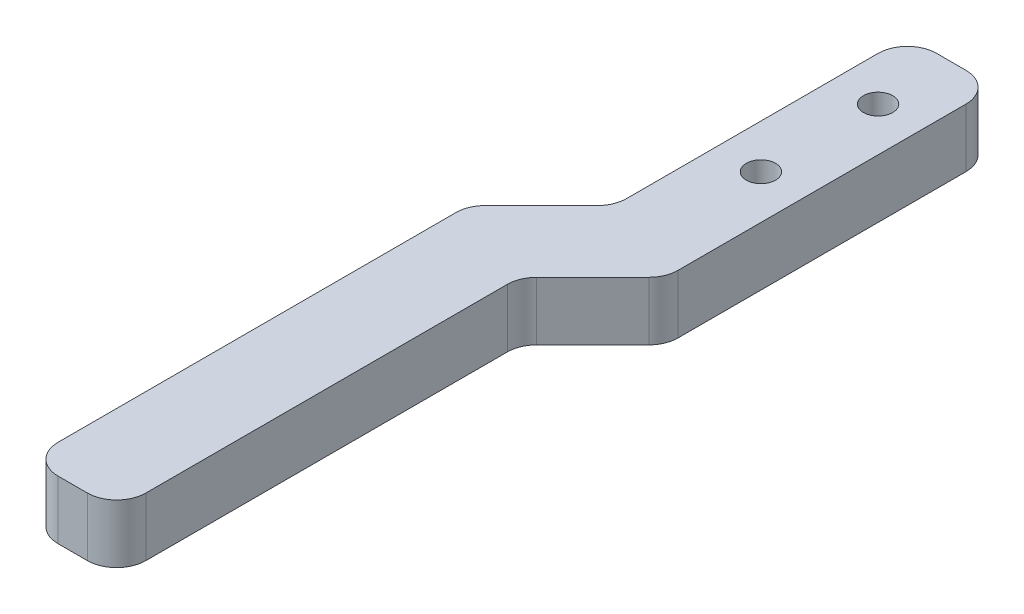
ISO-10303-21;
HEADER;
FILE_DESCRIPTION(('STEP AP214'),'2;1');
FILE_NAME('part.step','',(''),(''),'','','');
FILE_SCHEMA(('AUTOMOTIVE_DESIGN { 1 0 10303 214 1 1 1 1 }'));
ENDSEC;
DATA;
#1=APPLICATION_CONTEXT('core data for automotive mechanical design processes');
#2=APPLICATION_PROTOCOL_DEFINITION('international standard','automotive_design',2000,#1);
#3=PRODUCT_CONTEXT('',#1,'mechanical');
#4=PRODUCT('Part','Part','',(#3));
#5=PRODUCT_RELATED_PRODUCT_CATEGORY('part','',(#4));
#6=PRODUCT_DEFINITION_FORMATION('','',#4);
#7=PRODUCT_DEFINITION_CONTEXT('part definition',#1,'design');
#8=PRODUCT_DEFINITION('design','',#6,#7);
#9=PRODUCT_DEFINITION_SHAPE('','',#8);
#10=(LENGTH_UNIT() NAMED_UNIT(*) SI_UNIT(.MILLI.,.METRE.));
#11=(NAMED_UNIT(*) PLANE_ANGLE_UNIT() SI_UNIT($,.RADIAN.));
#12=(NAMED_UNIT(*) SI_UNIT($,.STERADIAN.) SOLID_ANGLE_UNIT());
#13=UNCERTAINTY_MEASURE_WITH_UNIT(LENGTH_MEASURE(1.E-05),#10,'distance_accuracy_value','');
#14=(GEOMETRIC_REPRESENTATION_CONTEXT(3) GLOBAL_UNCERTAINTY_ASSIGNED_CONTEXT((#13)) GLOBAL_UNIT_ASSIGNED_CONTEXT((#10,
#11,#12)) REPRESENTATION_CONTEXT('',''));
#15=CARTESIAN_POINT('',(0.,0.,0.));
#16=DIRECTION('',(0.,0.,1.));
#17=DIRECTION('',(1.,0.,0.));
#18=AXIS2_PLACEMENT_3D('',#15,#16,#17);
#19=CARTESIAN_POINT('',(0.,4.,0.));
#20=DIRECTION('',(0.,1.,0.));
#21=DIRECTION('',(0.,0.,1.));
#22=AXIS2_PLACEMENT_3D('',#19,#20,#21);
#23=PLANE('',#22);
#24=CARTESIAN_POINT('',(33.0000000000001,4.,-60.));
#25=DIRECTION('',(0.,1.,0.));
#26=DIRECTION('',(0.,0.,1.));
#27=AXIS2_PLACEMENT_3D('',#24,#25,#26);
#28=CIRCLE('',#27,0.999999999999994);
#29=CARTESIAN_POINT('',(33.0000000000001,4.,-59.));
#30=VERTEX_POINT('',#29);
#31=EDGE_CURVE('E269',#30,#30,#28,.T.);
#32=ORIENTED_EDGE('',*,*,#31,.F.);
#33=EDGE_LOOP('',(#32));
#34=FACE_BOUND('',#33,.T.);
#35=DIRECTION('',(-0.707106781186549,0.,0.707106781186546));
#36=VECTOR('',#35,1.);
#37=CARTESIAN_POINT('',(25.,4.,-40.));
#38=LINE('',#37,#36);
#39=CARTESIAN_POINT('',(29.4142135623731,4.,-44.4142135623731));
#40=VERTEX_POINT('',#39);
#41=CARTESIAN_POINT('',(25.5857864376269,4.,-40.5857864376269));
#42=VERTEX_POINT('',#41);
#43=EDGE_CURVE('E191',#40,#42,#38,.T.);
#44=ORIENTED_EDGE('',*,*,#43,.T.);
#45=CARTESIAN_POINT('',(27.,4.,-39.1715728752538));
#46=DIRECTION('',(0.,1.,0.));
#47=DIRECTION('',(0.,0.,1.));
#48=AXIS2_PLACEMENT_3D('',#45,#46,#47);
#49=CIRCLE('',#48,2.);
#50=CARTESIAN_POINT('',(25.,4.,-39.1715728752538));
#51=VERTEX_POINT('',#50);
#52=EDGE_CURVE('E212',#42,#51,#49,.T.);
#53=ORIENTED_EDGE('',*,*,#52,.T.);
#54=DIRECTION('',(0.,0.,1.));
#55=VECTOR('',#54,1.);
#56=CARTESIAN_POINT('',(25.,4.,-30.));
#57=LINE('',#56,#55);
#58=CARTESIAN_POINT('',(25.,4.,-12.));
#59=VERTEX_POINT('',#58);
#60=EDGE_CURVE('E175',#51,#59,#57,.T.);
#61=ORIENTED_EDGE('',*,*,#60,.T.);
#62=CARTESIAN_POINT('',(27.,4.,-12.));
#63=DIRECTION('',(0.,1.,0.));
#64=DIRECTION('',(0.,0.,1.));
#65=AXIS2_PLACEMENT_3D('',#62,#63,#64);
#66=CIRCLE('',#65,2.);
#67=CARTESIAN_POINT('',(27.,4.,-10.));
#68=VERTEX_POINT('',#67);
#69=EDGE_CURVE('E208',#59,#68,#66,.T.);
#70=ORIENTED_EDGE('',*,*,#69,.T.);
#71=DIRECTION('',(1.,0.,0.));
#72=VECTOR('',#71,1.);
#73=CARTESIAN_POINT('',(25.,4.,-10.));
#74=LINE('',#73,#72);
#75=CARTESIAN_POINT('',(29.,4.,-10.));
#76=VERTEX_POINT('',#75);
#77=EDGE_CURVE('E185',#68,#76,#74,.T.);
#78=ORIENTED_EDGE('',*,*,#77,.T.);
#79=CARTESIAN_POINT('',(29.,4.,-12.));
#80=DIRECTION('',(0.,1.,0.));
#81=DIRECTION('',(0.,0.,1.));
#82=AXIS2_PLACEMENT_3D('',#79,#80,#81);
#83=CIRCLE('',#82,2.);
#84=CARTESIAN_POINT('',(31.,4.,-12.));
#85=VERTEX_POINT('',#84);
#86=EDGE_CURVE('E210',#76,#85,#83,.T.);
#87=ORIENTED_EDGE('',*,*,#86,.T.);
#88=DIRECTION('',(0.,0.,-1.));
#89=VECTOR('',#88,1.);
#90=CARTESIAN_POINT('',(31.,4.,-10.));
#91=LINE('',#90,#89);
#92=CARTESIAN_POINT('',(31.,4.,-36.6862915010152));
#93=VERTEX_POINT('',#92);
#94=EDGE_CURVE('E364',#85,#93,#91,.T.);
#95=ORIENTED_EDGE('',*,*,#94,.T.);
#96=CARTESIAN_POINT('',(33.,4.,-36.6862915010152));
#97=DIRECTION('',(0.,1.,0.));
#98=DIRECTION('',(0.,0.,1.));
#99=AXIS2_PLACEMENT_3D('',#96,#97,#98);
#100=CIRCLE('',#99,2.);
#101=CARTESIAN_POINT('',(31.5857864376269,4.,-38.1005050633883));
#102=VERTEX_POINT('',#101);
#103=EDGE_CURVE('E245',#93,#102,#100,.F.);
#104=ORIENTED_EDGE('',*,*,#103,.T.);
#105=DIRECTION('',(0.707106781186548,0.,-0.707106781186547));
#106=VECTOR('',#105,1.);
#107=CARTESIAN_POINT('',(31.,4.,-37.5147186257614));
#108=LINE('',#107,#106);
#109=CARTESIAN_POINT('',(35.4142135623731,4.,-41.9289321881345));
#110=VERTEX_POINT('',#109);
#111=EDGE_CURVE('E360',#102,#110,#108,.T.);
#112=ORIENTED_EDGE('',*,*,#111,.T.);
#113=CARTESIAN_POINT('',(34.,4.,-43.3431457505076));
#114=DIRECTION('',(0.,1.,0.));
#115=DIRECTION('',(0.,0.,1.));
#116=AXIS2_PLACEMENT_3D('',#113,#114,#115);
#117=CIRCLE('',#116,2.);
#118=CARTESIAN_POINT('',(36.,4.,-43.3431457505076));
#119=VERTEX_POINT('',#118);
#120=EDGE_CURVE('E206',#110,#119,#117,.T.);
#121=ORIENTED_EDGE('',*,*,#120,.T.);
#122=DIRECTION('',(0.,0.,-1.));
#123=VECTOR('',#122,1.);
#124=CARTESIAN_POINT('',(36.0000000000001,4.,-64.9999999999999));
#125=LINE('',#124,#123);
#126=CARTESIAN_POINT('',(36.0000000000001,4.,-62.9999999999999));
#127=VERTEX_POINT('',#126);
#128=EDGE_CURVE('E357',#119,#127,#125,.T.);
#129=ORIENTED_EDGE('',*,*,#128,.T.);
#130=CARTESIAN_POINT('',(34.0000000000001,4.,-63.));
#131=DIRECTION('',(0.,1.,0.));
#132=DIRECTION('',(0.,0.,1.));
#133=AXIS2_PLACEMENT_3D('',#130,#131,#132);
#134=CIRCLE('',#133,2.);
#135=CARTESIAN_POINT('',(34.0000000000002,4.,-65.));
#136=VERTEX_POINT('',#135);
#137=EDGE_CURVE('E204',#127,#136,#134,.T.);
#138=ORIENTED_EDGE('',*,*,#137,.T.);
#139=DIRECTION('',(-1.,0.,0.));
#140=VECTOR('',#139,1.);
#141=CARTESIAN_POINT('',(30.0000000000002,4.,-65.));
#142=LINE('',#141,#140);
#143=CARTESIAN_POINT('',(32.0000000000002,4.,-65.));
#144=VERTEX_POINT('',#143);
#145=EDGE_CURVE('E261',#136,#144,#142,.T.);
#146=ORIENTED_EDGE('',*,*,#145,.T.);
#147=CARTESIAN_POINT('',(32.0000000000001,4.,-63.));
#148=DIRECTION('',(0.,1.,0.));
#149=DIRECTION('',(0.,0.,1.));
#150=AXIS2_PLACEMENT_3D('',#147,#148,#149);
#151=CIRCLE('',#150,2.);
#152=CARTESIAN_POINT('',(30.0000000000001,4.,-63.));
#153=VERTEX_POINT('',#152);
#154=EDGE_CURVE('E63',#144,#153,#151,.T.);
#155=ORIENTED_EDGE('',*,*,#154,.T.);
#156=DIRECTION('',(0.,0.,1.));
#157=VECTOR('',#156,1.);
#158=CARTESIAN_POINT('',(30.,4.,-45.));
#159=LINE('',#158,#157);
#160=CARTESIAN_POINT('',(30.,4.,-45.8284271247462));
#161=VERTEX_POINT('',#160);
#162=EDGE_CURVE('E257',#153,#161,#159,.T.);
#163=ORIENTED_EDGE('',*,*,#162,.T.);
#164=CARTESIAN_POINT('',(28.,4.,-45.8284271247462));
#165=DIRECTION('',(0.,1.,0.));
#166=DIRECTION('',(0.,0.,1.));
#167=AXIS2_PLACEMENT_3D('',#164,#165,#166);
#168=CIRCLE('',#167,2.);
#169=EDGE_CURVE('E11',#161,#40,#168,.F.);
#170=ORIENTED_EDGE('',*,*,#169,.T.);
#171=EDGE_LOOP('',(#44,#53,#61,#70,#78,#87,#95,#104,#112,#121,#129,#138,#146,#155,#163,#170));
#172=FACE_BOUND('',#171,.T.);
#173=CARTESIAN_POINT('',(33.0000000000001,4.,-52.));
#174=DIRECTION('',(0.,1.,0.));
#175=DIRECTION('',(0.,0.,1.));
#176=AXIS2_PLACEMENT_3D('',#173,#174,#175);
#177=CIRCLE('',#176,1.);
#178=CARTESIAN_POINT('',(33.0000000000001,4.,-51.));
#179=VERTEX_POINT('',#178);
#180=EDGE_CURVE('E374',#179,#179,#177,.T.);
#181=ORIENTED_EDGE('',*,*,#180,.F.);
#182=EDGE_LOOP('',(#181));
#183=FACE_BOUND('',#182,.T.);
#184=ADVANCED_FACE('F41',(#34,#172,#183),#23,.T.);
#185=CARTESIAN_POINT('',(0.,0.,0.));
#186=DIRECTION('',(0.,1.,0.));
#187=DIRECTION('',(0.,0.,1.));
#188=AXIS2_PLACEMENT_3D('',#185,#186,#187);
#189=PLANE('',#188);
#190=DIRECTION('',(0.,0.,1.));
#191=VECTOR('',#190,1.);
#192=CARTESIAN_POINT('',(25.,0.,-30.));
#193=LINE('',#192,#191);
#194=CARTESIAN_POINT('',(25.,0.,-39.1715728752538));
#195=VERTEX_POINT('',#194);
#196=CARTESIAN_POINT('',(25.,0.,-12.));
#197=VERTEX_POINT('',#196);
#198=EDGE_CURVE('E172',#195,#197,#193,.T.);
#199=ORIENTED_EDGE('',*,*,#198,.F.);
#200=CARTESIAN_POINT('',(27.,0.,-39.1715728752538));
#201=DIRECTION('',(0.,1.,0.));
#202=DIRECTION('',(0.,0.,1.));
#203=AXIS2_PLACEMENT_3D('',#200,#201,#202);
#204=CIRCLE('',#203,2.);
#205=CARTESIAN_POINT('',(25.5857864376269,0.,-40.5857864376269));
#206=VERTEX_POINT('',#205);
#207=EDGE_CURVE('E155',#195,#206,#204,.F.);
#208=ORIENTED_EDGE('',*,*,#207,.T.);
#209=DIRECTION('',(-0.707106781186549,0.,0.707106781186546));
#210=VECTOR('',#209,1.);
#211=CARTESIAN_POINT('',(25.,0.,-40.));
#212=LINE('',#211,#210);
#213=CARTESIAN_POINT('',(29.4142135623731,0.,-44.4142135623731));
#214=VERTEX_POINT('',#213);
#215=EDGE_CURVE('E183',#214,#206,#212,.T.);
#216=ORIENTED_EDGE('',*,*,#215,.F.);
#217=CARTESIAN_POINT('',(28.,0.,-45.8284271247462));
#218=DIRECTION('',(0.,1.,0.));
#219=DIRECTION('',(0.,0.,1.));
#220=AXIS2_PLACEMENT_3D('',#217,#218,#219);
#221=CIRCLE('',#220,2.);
#222=CARTESIAN_POINT('',(30.,0.,-45.8284271247462));
#223=VERTEX_POINT('',#222);
#224=EDGE_CURVE('E49',#214,#223,#221,.T.);
#225=ORIENTED_EDGE('',*,*,#224,.T.);
#226=DIRECTION('',(0.,0.,1.));
#227=VECTOR('',#226,1.);
#228=CARTESIAN_POINT('',(30.,0.,-45.));
#229=LINE('',#228,#227);
#230=CARTESIAN_POINT('',(30.0000000000001,0.,-63.));
#231=VERTEX_POINT('',#230);
#232=EDGE_CURVE('E187',#231,#223,#229,.T.);
#233=ORIENTED_EDGE('',*,*,#232,.F.);
#234=CARTESIAN_POINT('',(32.0000000000001,0.,-63.));
#235=DIRECTION('',(0.,1.,0.));
#236=DIRECTION('',(0.,0.,1.));
#237=AXIS2_PLACEMENT_3D('',#234,#235,#236);
#238=CIRCLE('',#237,2.);
#239=CARTESIAN_POINT('',(32.0000000000002,0.,-65.));
#240=VERTEX_POINT('',#239);
#241=EDGE_CURVE('E176',#231,#240,#238,.F.);
#242=ORIENTED_EDGE('',*,*,#241,.T.);
#243=DIRECTION('',(-1.,0.,0.));
#244=VECTOR('',#243,1.);
#245=CARTESIAN_POINT('',(30.0000000000002,0.,-65.));
#246=LINE('',#245,#244);
#247=CARTESIAN_POINT('',(34.0000000000002,0.,-65.));
#248=VERTEX_POINT('',#247);
#249=EDGE_CURVE('E251',#248,#240,#246,.T.);
#250=ORIENTED_EDGE('',*,*,#249,.F.);
#251=CARTESIAN_POINT('',(34.0000000000001,0.,-63.));
#252=DIRECTION('',(0.,1.,0.));
#253=DIRECTION('',(0.,0.,1.));
#254=AXIS2_PLACEMENT_3D('',#251,#252,#253);
#255=CIRCLE('',#254,2.);
#256=CARTESIAN_POINT('',(36.0000000000001,0.,-62.9999999999999));
#257=VERTEX_POINT('',#256);
#258=EDGE_CURVE('E194',#248,#257,#255,.F.);
#259=ORIENTED_EDGE('',*,*,#258,.T.);
#260=DIRECTION('',(0.,0.,-1.));
#261=VECTOR('',#260,1.);
#262=CARTESIAN_POINT('',(36.0000000000001,0.,-64.9999999999999));
#263=LINE('',#262,#261);
#264=CARTESIAN_POINT('',(36.,0.,-43.3431457505076));
#265=VERTEX_POINT('',#264);
#266=EDGE_CURVE('E275',#265,#257,#263,.T.);
#267=ORIENTED_EDGE('',*,*,#266,.F.);
#268=CARTESIAN_POINT('',(34.,0.,-43.3431457505076));
#269=DIRECTION('',(0.,1.,0.));
#270=DIRECTION('',(0.,0.,1.));
#271=AXIS2_PLACEMENT_3D('',#268,#269,#270);
#272=CIRCLE('',#271,2.);
#273=CARTESIAN_POINT('',(35.4142135623731,0.,-41.9289321881345));
#274=VERTEX_POINT('',#273);
#275=EDGE_CURVE('E196',#265,#274,#272,.F.);
#276=ORIENTED_EDGE('',*,*,#275,.T.);
#277=DIRECTION('',(0.707106781186548,0.,-0.707106781186547));
#278=VECTOR('',#277,1.);
#279=CARTESIAN_POINT('',(31.,0.,-37.5147186257614));
#280=LINE('',#279,#278);
#281=CARTESIAN_POINT('',(31.5857864376269,0.,-38.1005050633883));
#282=VERTEX_POINT('',#281);
#283=EDGE_CURVE('E272',#282,#274,#280,.T.);
#284=ORIENTED_EDGE('',*,*,#283,.F.);
#285=CARTESIAN_POINT('',(33.,0.,-36.6862915010152));
#286=DIRECTION('',(0.,1.,0.));
#287=DIRECTION('',(0.,0.,1.));
#288=AXIS2_PLACEMENT_3D('',#285,#286,#287);
#289=CIRCLE('',#288,2.);
#290=CARTESIAN_POINT('',(31.,0.,-36.6862915010152));
#291=VERTEX_POINT('',#290);
#292=EDGE_CURVE('E243',#282,#291,#289,.T.);
#293=ORIENTED_EDGE('',*,*,#292,.T.);
#294=DIRECTION('',(0.,0.,-1.));
#295=VECTOR('',#294,1.);
#296=CARTESIAN_POINT('',(31.,0.,-25.5147186257614));
#297=LINE('',#296,#295);
#298=CARTESIAN_POINT('',(31.,0.,-12.));
#299=VERTEX_POINT('',#298);
#300=EDGE_CURVE('E268',#299,#291,#297,.T.);
#301=ORIENTED_EDGE('',*,*,#300,.F.);
#302=CARTESIAN_POINT('',(29.,0.,-12.));
#303=DIRECTION('',(0.,1.,0.));
#304=DIRECTION('',(0.,0.,1.));
#305=AXIS2_PLACEMENT_3D('',#302,#303,#304);
#306=CIRCLE('',#305,2.);
#307=CARTESIAN_POINT('',(29.,0.,-10.));
#308=VERTEX_POINT('',#307);
#309=EDGE_CURVE('E166',#299,#308,#306,.F.);
#310=ORIENTED_EDGE('',*,*,#309,.T.);
#311=DIRECTION('',(1.,0.,0.));
#312=VECTOR('',#311,1.);
#313=CARTESIAN_POINT('',(25.,0.,-10.));
#314=LINE('',#313,#312);
#315=CARTESIAN_POINT('',(27.,0.,-10.));
#316=VERTEX_POINT('',#315);
#317=EDGE_CURVE('E265',#316,#308,#314,.T.);
#318=ORIENTED_EDGE('',*,*,#317,.F.);
#319=CARTESIAN_POINT('',(27.,0.,-12.));
#320=DIRECTION('',(0.,1.,0.));
#321=DIRECTION('',(0.,0.,1.));
#322=AXIS2_PLACEMENT_3D('',#319,#320,#321);
#323=CIRCLE('',#322,2.);
#324=EDGE_CURVE('E182',#316,#197,#323,.F.);
#325=ORIENTED_EDGE('',*,*,#324,.T.);
#326=EDGE_LOOP('',(#199,#208,#216,#225,#233,#242,#250,#259,#267,#276,#284,#293,#301,#310,#318,#325));
#327=FACE_BOUND('',#326,.T.);
#328=CARTESIAN_POINT('',(33.0000000000001,0.,-60.));
#329=DIRECTION('',(0.,1.,0.));
#330=DIRECTION('',(0.,0.,1.));
#331=AXIS2_PLACEMENT_3D('',#328,#329,#330);
#332=CIRCLE('',#331,0.999999999999994);
#333=CARTESIAN_POINT('',(33.0000000000001,0.,-59.));
#334=VERTEX_POINT('',#333);
#335=EDGE_CURVE('E371',#334,#334,#332,.T.);
#336=ORIENTED_EDGE('',*,*,#335,.T.);
#337=EDGE_LOOP('',(#336));
#338=FACE_BOUND('',#337,.T.);
#339=CARTESIAN_POINT('',(33.0000000000001,0.,-52.));
#340=DIRECTION('',(0.,1.,0.));
#341=DIRECTION('',(0.,0.,1.));
#342=AXIS2_PLACEMENT_3D('',#339,#340,#341);
#343=CIRCLE('',#342,1.);
#344=CARTESIAN_POINT('',(33.0000000000001,0.,-51.));
#345=VERTEX_POINT('',#344);
#346=EDGE_CURVE('E377',#345,#345,#343,.T.);
#347=ORIENTED_EDGE('',*,*,#346,.T.);
#348=EDGE_LOOP('',(#347));
#349=FACE_BOUND('',#348,.T.);
#350=ADVANCED_FACE('F179',(#327,#338,#349),#189,.F.);
#351=CARTESIAN_POINT('',(25.,4.,-10.));
#352=DIRECTION('',(0.,0.,-1.));
#353=DIRECTION('',(-1.,0.,0.));
#354=AXIS2_PLACEMENT_3D('',#351,#352,#353);
#355=PLANE('',#354);
#356=ORIENTED_EDGE('',*,*,#317,.T.);
#357=DIRECTION('',(0.,-1.,0.));
#358=VECTOR('',#357,1.);
#359=CARTESIAN_POINT('',(29.,4.,-10.));
#360=LINE('',#359,#358);
#361=EDGE_CURVE('E222',#308,#76,#360,.F.);
#362=ORIENTED_EDGE('',*,*,#361,.T.);
#363=ORIENTED_EDGE('',*,*,#77,.F.);
#364=DIRECTION('',(0.,-1.,0.));
#365=VECTOR('',#364,1.);
#366=CARTESIAN_POINT('',(27.,4.,-10.));
#367=LINE('',#366,#365);
#368=EDGE_CURVE('E219',#68,#316,#367,.T.);
#369=ORIENTED_EDGE('',*,*,#368,.T.);
#370=EDGE_LOOP('',(#356,#362,#363,#369));
#371=FACE_BOUND('',#370,.T.);
#372=ADVANCED_FACE('F300',(#371),#355,.F.);
#373=CARTESIAN_POINT('',(31.,4.,-25.5147186257614));
#374=DIRECTION('',(-1.,0.,0.));
#375=DIRECTION('',(0.,0.,1.));
#376=AXIS2_PLACEMENT_3D('',#373,#374,#375);
#377=PLANE('',#376);
#378=ORIENTED_EDGE('',*,*,#94,.F.);
#379=DIRECTION('',(0.,-1.,0.));
#380=VECTOR('',#379,1.);
#381=CARTESIAN_POINT('',(31.,4.,-12.));
#382=LINE('',#381,#380);
#383=EDGE_CURVE('E216',#85,#299,#382,.T.);
#384=ORIENTED_EDGE('',*,*,#383,.T.);
#385=ORIENTED_EDGE('',*,*,#300,.T.);
#386=DIRECTION('',(0.,-1.,0.));
#387=VECTOR('',#386,1.);
#388=CARTESIAN_POINT('',(31.,4.,-36.6862915010152));
#389=LINE('',#388,#387);
#390=EDGE_CURVE('E214',#291,#93,#389,.F.);
#391=ORIENTED_EDGE('',*,*,#390,.T.);
#392=EDGE_LOOP('',(#378,#384,#385,#391));
#393=FACE_BOUND('',#392,.T.);
#394=ADVANCED_FACE('F322',(#393),#377,.F.);
#395=CARTESIAN_POINT('',(31.,4.,-37.5147186257614));
#396=DIRECTION('',(-0.707106781186547,0.,-0.707106781186548));
#397=DIRECTION('',(-0.707106781186548,0.,0.707106781186547));
#398=AXIS2_PLACEMENT_3D('',#395,#396,#397);
#399=PLANE('',#398);
#400=ORIENTED_EDGE('',*,*,#111,.F.);
#401=DIRECTION('',(0.,-1.,0.));
#402=VECTOR('',#401,1.);
#403=CARTESIAN_POINT('',(31.5857864376269,0.,-38.1005050633883));
#404=LINE('',#403,#402);
#405=EDGE_CURVE('E226',#102,#282,#404,.T.);
#406=ORIENTED_EDGE('',*,*,#405,.T.);
#407=ORIENTED_EDGE('',*,*,#283,.T.);
#408=DIRECTION('',(0.,-1.,0.));
#409=VECTOR('',#408,1.);
#410=CARTESIAN_POINT('',(35.4142135623731,4.,-41.9289321881345));
#411=LINE('',#410,#409);
#412=EDGE_CURVE('E224',#274,#110,#411,.F.);
#413=ORIENTED_EDGE('',*,*,#412,.T.);
#414=EDGE_LOOP('',(#400,#406,#407,#413));
#415=FACE_BOUND('',#414,.T.);
#416=ADVANCED_FACE('F318',(#415),#399,.F.);
#417=CARTESIAN_POINT('',(36.0000000000001,4.,-64.9999999999999));
#418=DIRECTION('',(-1.,0.,0.));
#419=DIRECTION('',(0.,0.,1.));
#420=AXIS2_PLACEMENT_3D('',#417,#418,#419);
#421=PLANE('',#420);
#422=ORIENTED_EDGE('',*,*,#128,.F.);
#423=DIRECTION('',(0.,-1.,0.));
#424=VECTOR('',#423,1.);
#425=CARTESIAN_POINT('',(36.,4.,-43.3431457505076));
#426=LINE('',#425,#424);
#427=EDGE_CURVE('E235',#119,#265,#426,.T.);
#428=ORIENTED_EDGE('',*,*,#427,.T.);
#429=ORIENTED_EDGE('',*,*,#266,.T.);
#430=DIRECTION('',(0.,-1.,0.));
#431=VECTOR('',#430,1.);
#432=CARTESIAN_POINT('',(36.0000000000001,4.,-62.9999999999999));
#433=LINE('',#432,#431);
#434=EDGE_CURVE('E233',#257,#127,#433,.F.);
#435=ORIENTED_EDGE('',*,*,#434,.T.);
#436=EDGE_LOOP('',(#422,#428,#429,#435));
#437=FACE_BOUND('',#436,.T.);
#438=ADVANCED_FACE('F315',(#437),#421,.F.);
#439=CARTESIAN_POINT('',(30.0000000000002,4.,-65.));
#440=DIRECTION('',(0.,0.,1.));
#441=DIRECTION('',(1.,0.,0.));
#442=AXIS2_PLACEMENT_3D('',#439,#440,#441);
#443=PLANE('',#442);
#444=ORIENTED_EDGE('',*,*,#145,.F.);
#445=DIRECTION('',(0.,-1.,0.));
#446=VECTOR('',#445,1.);
#447=CARTESIAN_POINT('',(34.0000000000002,4.,-65.));
#448=LINE('',#447,#446);
#449=EDGE_CURVE('E240',#136,#248,#448,.T.);
#450=ORIENTED_EDGE('',*,*,#449,.T.);
#451=ORIENTED_EDGE('',*,*,#249,.T.);
#452=DIRECTION('',(0.,-1.,0.));
#453=VECTOR('',#452,1.);
#454=CARTESIAN_POINT('',(32.0000000000002,4.,-65.));
#455=LINE('',#454,#453);
#456=EDGE_CURVE('E238',#240,#144,#455,.F.);
#457=ORIENTED_EDGE('',*,*,#456,.T.);
#458=EDGE_LOOP('',(#444,#450,#451,#457));
#459=FACE_BOUND('',#458,.T.);
#460=ADVANCED_FACE('F283',(#459),#443,.F.);
#461=CARTESIAN_POINT('',(30.,4.,-45.));
#462=DIRECTION('',(1.,0.,0.));
#463=DIRECTION('',(0.,0.,-1.));
#464=AXIS2_PLACEMENT_3D('',#461,#462,#463);
#465=PLANE('',#464);
#466=ORIENTED_EDGE('',*,*,#232,.T.);
#467=DIRECTION('',(0.,-1.,0.));
#468=VECTOR('',#467,1.);
#469=CARTESIAN_POINT('',(30.,4.,-45.8284271247462));
#470=LINE('',#469,#468);
#471=EDGE_CURVE('E56',#223,#161,#470,.F.);
#472=ORIENTED_EDGE('',*,*,#471,.T.);
#473=ORIENTED_EDGE('',*,*,#162,.F.);
#474=DIRECTION('',(0.,-1.,0.));
#475=VECTOR('',#474,1.);
#476=CARTESIAN_POINT('',(30.0000000000001,4.,-63.));
#477=LINE('',#476,#475);
#478=EDGE_CURVE('E229',#153,#231,#477,.T.);
#479=ORIENTED_EDGE('',*,*,#478,.T.);
#480=EDGE_LOOP('',(#466,#472,#473,#479));
#481=FACE_BOUND('',#480,.T.);
#482=ADVANCED_FACE('F249',(#481),#465,.F.);
#483=CARTESIAN_POINT('',(25.,4.,-40.));
#484=DIRECTION('',(0.707106781186546,0.,0.707106781186549));
#485=DIRECTION('',(0.707106781186549,0.,-0.707106781186546));
#486=AXIS2_PLACEMENT_3D('',#483,#484,#485);
#487=PLANE('',#486);
#488=ORIENTED_EDGE('',*,*,#215,.T.);
#489=DIRECTION('',(0.,-1.,0.));
#490=VECTOR('',#489,1.);
#491=CARTESIAN_POINT('',(25.5857864376269,4.,-40.5857864376269));
#492=LINE('',#491,#490);
#493=EDGE_CURVE('E160',#206,#42,#492,.F.);
#494=ORIENTED_EDGE('',*,*,#493,.T.);
#495=ORIENTED_EDGE('',*,*,#43,.F.);
#496=DIRECTION('',(0.,-1.,0.));
#497=VECTOR('',#496,1.);
#498=CARTESIAN_POINT('',(29.4142135623731,0.,-44.4142135623731));
#499=LINE('',#498,#497);
#500=EDGE_CURVE('E165',#40,#214,#499,.T.);
#501=ORIENTED_EDGE('',*,*,#500,.T.);
#502=EDGE_LOOP('',(#488,#494,#495,#501));
#503=FACE_BOUND('',#502,.T.);
#504=ADVANCED_FACE('F259',(#503),#487,.F.);
#505=CARTESIAN_POINT('',(25.,4.,-30.));
#506=DIRECTION('',(1.,0.,0.));
#507=DIRECTION('',(0.,0.,-1.));
#508=AXIS2_PLACEMENT_3D('',#505,#506,#507);
#509=PLANE('',#508);
#510=ORIENTED_EDGE('',*,*,#60,.F.);
#511=DIRECTION('',(0.,-1.,0.));
#512=VECTOR('',#511,1.);
#513=CARTESIAN_POINT('',(25.,4.,-39.1715728752538));
#514=LINE('',#513,#512);
#515=EDGE_CURVE('E159',#51,#195,#514,.T.);
#516=ORIENTED_EDGE('',*,*,#515,.T.);
#517=ORIENTED_EDGE('',*,*,#198,.T.);
#518=DIRECTION('',(0.,-1.,0.));
#519=VECTOR('',#518,1.);
#520=CARTESIAN_POINT('',(25.,4.,-12.));
#521=LINE('',#520,#519);
#522=EDGE_CURVE('E177',#197,#59,#521,.F.);
#523=ORIENTED_EDGE('',*,*,#522,.T.);
#524=EDGE_LOOP('',(#510,#516,#517,#523));
#525=FACE_BOUND('',#524,.T.);
#526=ADVANCED_FACE('F171',(#525),#509,.F.);
#527=CARTESIAN_POINT('',(33.0000000000001,4.,-60.));
#528=DIRECTION('',(0.,-1.,0.));
#529=DIRECTION('',(0.,0.,-1.));
#530=AXIS2_PLACEMENT_3D('',#527,#528,#529);
#531=CYLINDRICAL_SURFACE('',#530,0.999999999999994);
#532=ORIENTED_EDGE('',*,*,#31,.T.);
#533=EDGE_LOOP('',(#532));
#534=FACE_BOUND('',#533,.T.);
#535=ORIENTED_EDGE('',*,*,#335,.F.);
#536=EDGE_LOOP('',(#535));
#537=FACE_BOUND('',#536,.T.);
#538=ADVANCED_FACE('F304',(#534,#537),#531,.F.);
#539=CARTESIAN_POINT('',(33.0000000000001,4.,-52.));
#540=DIRECTION('',(0.,-1.,0.));
#541=DIRECTION('',(0.,0.,-1.));
#542=AXIS2_PLACEMENT_3D('',#539,#540,#541);
#543=CYLINDRICAL_SURFACE('',#542,1.);
#544=ORIENTED_EDGE('',*,*,#180,.T.);
#545=EDGE_LOOP('',(#544));
#546=FACE_BOUND('',#545,.T.);
#547=ORIENTED_EDGE('',*,*,#346,.F.);
#548=EDGE_LOOP('',(#547));
#549=FACE_BOUND('',#548,.T.);
#550=ADVANCED_FACE('F333',(#546,#549),#543,.F.);
#551=CARTESIAN_POINT('',(27.,4.,-39.1715728752538));
#552=DIRECTION('',(0.,-1.,0.));
#553=DIRECTION('',(0.,0.,-1.));
#554=AXIS2_PLACEMENT_3D('',#551,#552,#553);
#555=CYLINDRICAL_SURFACE('',#554,2.);
#556=ORIENTED_EDGE('',*,*,#52,.F.);
#557=ORIENTED_EDGE('',*,*,#493,.F.);
#558=ORIENTED_EDGE('',*,*,#207,.F.);
#559=ORIENTED_EDGE('',*,*,#515,.F.);
#560=EDGE_LOOP('',(#556,#557,#558,#559));
#561=FACE_BOUND('',#560,.T.);
#562=ADVANCED_FACE('F158',(#561),#555,.T.);
#563=CARTESIAN_POINT('',(29.,4.,-12.));
#564=DIRECTION('',(0.,-1.,0.));
#565=DIRECTION('',(0.,0.,-1.));
#566=AXIS2_PLACEMENT_3D('',#563,#564,#565);
#567=CYLINDRICAL_SURFACE('',#566,2.);
#568=ORIENTED_EDGE('',*,*,#86,.F.);
#569=ORIENTED_EDGE('',*,*,#361,.F.);
#570=ORIENTED_EDGE('',*,*,#309,.F.);
#571=ORIENTED_EDGE('',*,*,#383,.F.);
#572=EDGE_LOOP('',(#568,#569,#570,#571));
#573=FACE_BOUND('',#572,.T.);
#574=ADVANCED_FACE('F332',(#573),#567,.T.);
#575=CARTESIAN_POINT('',(27.,4.,-12.));
#576=DIRECTION('',(0.,-1.,0.));
#577=DIRECTION('',(0.,0.,-1.));
#578=AXIS2_PLACEMENT_3D('',#575,#576,#577);
#579=CYLINDRICAL_SURFACE('',#578,2.);
#580=ORIENTED_EDGE('',*,*,#69,.F.);
#581=ORIENTED_EDGE('',*,*,#522,.F.);
#582=ORIENTED_EDGE('',*,*,#324,.F.);
#583=ORIENTED_EDGE('',*,*,#368,.F.);
#584=EDGE_LOOP('',(#580,#581,#582,#583));
#585=FACE_BOUND('',#584,.T.);
#586=ADVANCED_FACE('F336',(#585),#579,.T.);
#587=CARTESIAN_POINT('',(33.,4.,-36.6862915010152));
#588=DIRECTION('',(0.,1.,0.));
#589=DIRECTION('',(0.,0.,1.));
#590=AXIS2_PLACEMENT_3D('',#587,#588,#589);
#591=CYLINDRICAL_SURFACE('',#590,2.);
#592=ORIENTED_EDGE('',*,*,#103,.F.);
#593=ORIENTED_EDGE('',*,*,#390,.F.);
#594=ORIENTED_EDGE('',*,*,#292,.F.);
#595=ORIENTED_EDGE('',*,*,#405,.F.);
#596=EDGE_LOOP('',(#592,#593,#594,#595));
#597=FACE_BOUND('',#596,.T.);
#598=ADVANCED_FACE('F340',(#597),#591,.F.);
#599=CARTESIAN_POINT('',(28.,4.,-45.8284271247462));
#600=DIRECTION('',(0.,1.,0.));
#601=DIRECTION('',(0.,0.,1.));
#602=AXIS2_PLACEMENT_3D('',#599,#600,#601);
#603=CYLINDRICAL_SURFACE('',#602,2.);
#604=ORIENTED_EDGE('',*,*,#169,.F.);
#605=ORIENTED_EDGE('',*,*,#471,.F.);
#606=ORIENTED_EDGE('',*,*,#224,.F.);
#607=ORIENTED_EDGE('',*,*,#500,.F.);
#608=EDGE_LOOP('',(#604,#605,#606,#607));
#609=FACE_BOUND('',#608,.T.);
#610=ADVANCED_FACE('F253',(#609),#603,.F.);
#611=CARTESIAN_POINT('',(34.,4.,-43.3431457505076));
#612=DIRECTION('',(0.,-1.,0.));
#613=DIRECTION('',(0.,0.,-1.));
#614=AXIS2_PLACEMENT_3D('',#611,#612,#613);
#615=CYLINDRICAL_SURFACE('',#614,2.);
#616=ORIENTED_EDGE('',*,*,#120,.F.);
#617=ORIENTED_EDGE('',*,*,#412,.F.);
#618=ORIENTED_EDGE('',*,*,#275,.F.);
#619=ORIENTED_EDGE('',*,*,#427,.F.);
#620=EDGE_LOOP('',(#616,#617,#618,#619));
#621=FACE_BOUND('',#620,.T.);
#622=ADVANCED_FACE('F291',(#621),#615,.T.);
#623=CARTESIAN_POINT('',(34.0000000000001,4.,-63.));
#624=DIRECTION('',(0.,-1.,0.));
#625=DIRECTION('',(0.,0.,-1.));
#626=AXIS2_PLACEMENT_3D('',#623,#624,#625);
#627=CYLINDRICAL_SURFACE('',#626,2.);
#628=ORIENTED_EDGE('',*,*,#137,.F.);
#629=ORIENTED_EDGE('',*,*,#434,.F.);
#630=ORIENTED_EDGE('',*,*,#258,.F.);
#631=ORIENTED_EDGE('',*,*,#449,.F.);
#632=EDGE_LOOP('',(#628,#629,#630,#631));
#633=FACE_BOUND('',#632,.T.);
#634=ADVANCED_FACE('F287',(#633),#627,.T.);
#635=CARTESIAN_POINT('',(32.0000000000001,4.,-63.));
#636=DIRECTION('',(0.,-1.,0.));
#637=DIRECTION('',(0.,0.,-1.));
#638=AXIS2_PLACEMENT_3D('',#635,#636,#637);
#639=CYLINDRICAL_SURFACE('',#638,2.);
#640=ORIENTED_EDGE('',*,*,#154,.F.);
#641=ORIENTED_EDGE('',*,*,#456,.F.);
#642=ORIENTED_EDGE('',*,*,#241,.F.);
#643=ORIENTED_EDGE('',*,*,#478,.F.);
#644=EDGE_LOOP('',(#640,#641,#642,#643));
#645=FACE_BOUND('',#644,.T.);
#646=ADVANCED_FACE('F43',(#645),#639,.T.);
#647=CLOSED_SHELL('',(#184,#350,#372,#394,#416,#438,#460,#482,#504,#526,#538,#550,#562,#574,
#586,#598,#610,#622,#634,#646));
#648=MANIFOLD_SOLID_BREP('B2',#647);
#649=ADVANCED_BREP_SHAPE_REPRESENTATION('',(#18,#648),#14);
#650=SHAPE_DEFINITION_REPRESENTATION(#9,#649);
ENDSEC;
END-ISO-10303-21;
